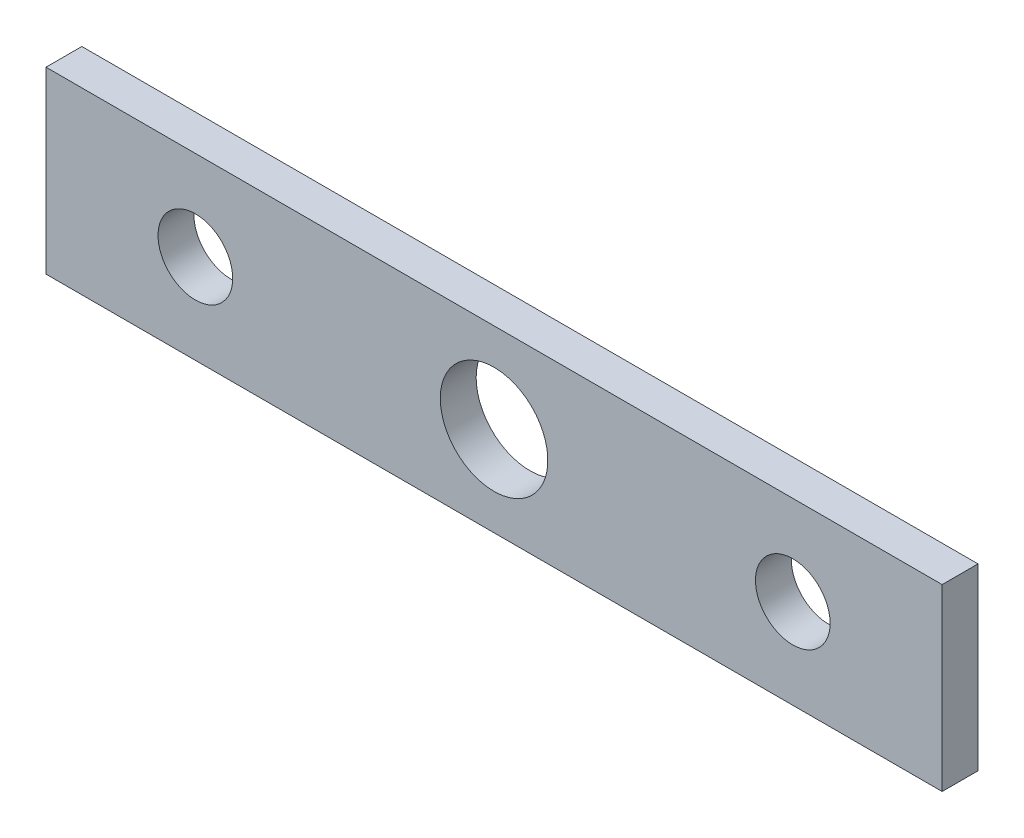
ISO-10303-21;
HEADER;
FILE_DESCRIPTION(('STEP AP214'),'2;1');
FILE_NAME('part.step','',(''),(''),'','','');
FILE_SCHEMA(('AUTOMOTIVE_DESIGN { 1 0 10303 214 1 1 1 1 }'));
ENDSEC;
DATA;
#1=APPLICATION_CONTEXT('core data for automotive mechanical design processes');
#2=APPLICATION_PROTOCOL_DEFINITION('international standard','automotive_design',2000,#1);
#3=PRODUCT_CONTEXT('',#1,'mechanical');
#4=PRODUCT('Part','Part','',(#3));
#5=PRODUCT_RELATED_PRODUCT_CATEGORY('part','',(#4));
#6=PRODUCT_DEFINITION_FORMATION('','',#4);
#7=PRODUCT_DEFINITION_CONTEXT('part definition',#1,'design');
#8=PRODUCT_DEFINITION('design','',#6,#7);
#9=PRODUCT_DEFINITION_SHAPE('','',#8);
#10=(LENGTH_UNIT() NAMED_UNIT(*) SI_UNIT(.MILLI.,.METRE.));
#11=(NAMED_UNIT(*) PLANE_ANGLE_UNIT() SI_UNIT($,.RADIAN.));
#12=(NAMED_UNIT(*) SI_UNIT($,.STERADIAN.) SOLID_ANGLE_UNIT());
#13=UNCERTAINTY_MEASURE_WITH_UNIT(LENGTH_MEASURE(1.E-05),#10,'distance_accuracy_value','');
#14=(GEOMETRIC_REPRESENTATION_CONTEXT(3) GLOBAL_UNCERTAINTY_ASSIGNED_CONTEXT((#13)) GLOBAL_UNIT_ASSIGNED_CONTEXT((#10,
#11,#12)) REPRESENTATION_CONTEXT('',''));
#15=CARTESIAN_POINT('',(0.,0.,0.));
#16=DIRECTION('',(0.,0.,1.));
#17=DIRECTION('',(1.,0.,0.));
#18=AXIS2_PLACEMENT_3D('',#15,#16,#17);
#19=CARTESIAN_POINT('',(0.,0.,12.));
#20=DIRECTION('',(0.,0.,-1.));
#21=DIRECTION('',(-1.,0.,0.));
#22=AXIS2_PLACEMENT_3D('',#19,#20,#21);
#23=PLANE('',#22);
#24=CARTESIAN_POINT('',(3.88578058618805E-13,0.,12.));
#25=DIRECTION('',(0.,0.,-1.));
#26=DIRECTION('',(-1.,0.,0.));
#27=AXIS2_PLACEMENT_3D('',#24,#25,#26);
#28=CIRCLE('',#27,18.);
#29=CARTESIAN_POINT('',(-17.9999999999996,0.,12.));
#30=VERTEX_POINT('',#29);
#31=EDGE_CURVE('E125',#30,#30,#28,.F.);
#32=ORIENTED_EDGE('',*,*,#31,.F.);
#33=EDGE_LOOP('',(#32));
#34=FACE_BOUND('',#33,.T.);
#35=DIRECTION('',(0.,1.,0.));
#36=VECTOR('',#35,1.);
#37=CARTESIAN_POINT('',(150.,-30.,12.));
#38=LINE('',#37,#36);
#39=CARTESIAN_POINT('',(150.,-30.,12.));
#40=VERTEX_POINT('',#39);
#41=CARTESIAN_POINT('',(150.,30.,12.));
#42=VERTEX_POINT('',#41);
#43=EDGE_CURVE('E89',#40,#42,#38,.T.);
#44=ORIENTED_EDGE('',*,*,#43,.T.);
#45=DIRECTION('',(-1.,0.,0.));
#46=VECTOR('',#45,1.);
#47=CARTESIAN_POINT('',(-150.,30.,12.));
#48=LINE('',#47,#46);
#49=CARTESIAN_POINT('',(-150.,30.,12.));
#50=VERTEX_POINT('',#49);
#51=EDGE_CURVE('E84',#42,#50,#48,.T.);
#52=ORIENTED_EDGE('',*,*,#51,.T.);
#53=DIRECTION('',(0.,-1.,0.));
#54=VECTOR('',#53,1.);
#55=CARTESIAN_POINT('',(-150.,-30.,12.));
#56=LINE('',#55,#54);
#57=CARTESIAN_POINT('',(-150.,-30.,12.));
#58=VERTEX_POINT('',#57);
#59=EDGE_CURVE('E87',#50,#58,#56,.T.);
#60=ORIENTED_EDGE('',*,*,#59,.T.);
#61=DIRECTION('',(1.,0.,0.));
#62=VECTOR('',#61,1.);
#63=CARTESIAN_POINT('',(-150.,-30.,12.));
#64=LINE('',#63,#62);
#65=EDGE_CURVE('E54',#58,#40,#64,.T.);
#66=ORIENTED_EDGE('',*,*,#65,.T.);
#67=EDGE_LOOP('',(#44,#52,#60,#66));
#68=FACE_BOUND('',#67,.T.);
#69=CARTESIAN_POINT('',(100.,0.,12.));
#70=DIRECTION('',(0.,0.,1.));
#71=DIRECTION('',(1.,0.,0.));
#72=AXIS2_PLACEMENT_3D('',#69,#70,#71);
#73=CIRCLE('',#72,12.5);
#74=CARTESIAN_POINT('',(112.5,0.,12.));
#75=VERTEX_POINT('',#74);
#76=EDGE_CURVE('E104',#75,#75,#73,.T.);
#77=ORIENTED_EDGE('',*,*,#76,.F.);
#78=EDGE_LOOP('',(#77));
#79=FACE_BOUND('',#78,.T.);
#80=CARTESIAN_POINT('',(-100.,0.,12.));
#81=DIRECTION('',(0.,0.,1.));
#82=DIRECTION('',(1.,0.,0.));
#83=AXIS2_PLACEMENT_3D('',#80,#81,#82);
#84=CIRCLE('',#83,12.5);
#85=CARTESIAN_POINT('',(-87.5,0.,12.));
#86=VERTEX_POINT('',#85);
#87=EDGE_CURVE('E119',#86,#86,#84,.T.);
#88=ORIENTED_EDGE('',*,*,#87,.F.);
#89=EDGE_LOOP('',(#88));
#90=FACE_BOUND('',#89,.T.);
#91=ADVANCED_FACE('F37',(#34,#68,#79,#90),#23,.F.);
#92=CARTESIAN_POINT('',(0.,0.,0.));
#93=DIRECTION('',(0.,0.,-1.));
#94=DIRECTION('',(-1.,0.,0.));
#95=AXIS2_PLACEMENT_3D('',#92,#93,#94);
#96=PLANE('',#95);
#97=CARTESIAN_POINT('',(3.88578058618805E-13,0.,0.));
#98=DIRECTION('',(0.,0.,-1.));
#99=DIRECTION('',(-1.,0.,0.));
#100=AXIS2_PLACEMENT_3D('',#97,#98,#99);
#101=CIRCLE('',#100,18.);
#102=CARTESIAN_POINT('',(-17.9999999999996,0.,0.));
#103=VERTEX_POINT('',#102);
#104=EDGE_CURVE('E130',#103,#103,#101,.T.);
#105=ORIENTED_EDGE('',*,*,#104,.F.);
#106=EDGE_LOOP('',(#105));
#107=FACE_BOUND('',#106,.T.);
#108=CARTESIAN_POINT('',(100.,0.,0.));
#109=DIRECTION('',(0.,0.,1.));
#110=DIRECTION('',(1.,0.,0.));
#111=AXIS2_PLACEMENT_3D('',#108,#109,#110);
#112=CIRCLE('',#111,12.5);
#113=CARTESIAN_POINT('',(112.5,0.,0.));
#114=VERTEX_POINT('',#113);
#115=EDGE_CURVE('E116',#114,#114,#112,.T.);
#116=ORIENTED_EDGE('',*,*,#115,.T.);
#117=EDGE_LOOP('',(#116));
#118=FACE_BOUND('',#117,.T.);
#119=DIRECTION('',(0.,1.,0.));
#120=VECTOR('',#119,1.);
#121=CARTESIAN_POINT('',(150.,-30.,0.));
#122=LINE('',#121,#120);
#123=CARTESIAN_POINT('',(150.,-30.,0.));
#124=VERTEX_POINT('',#123);
#125=CARTESIAN_POINT('',(150.,30.,0.));
#126=VERTEX_POINT('',#125);
#127=EDGE_CURVE('E101',#124,#126,#122,.T.);
#128=ORIENTED_EDGE('',*,*,#127,.F.);
#129=DIRECTION('',(1.,0.,0.));
#130=VECTOR('',#129,1.);
#131=CARTESIAN_POINT('',(-150.,-30.,0.));
#132=LINE('',#131,#130);
#133=CARTESIAN_POINT('',(-150.,-30.,0.));
#134=VERTEX_POINT('',#133);
#135=EDGE_CURVE('E77',#134,#124,#132,.T.);
#136=ORIENTED_EDGE('',*,*,#135,.F.);
#137=DIRECTION('',(0.,-1.,0.));
#138=VECTOR('',#137,1.);
#139=CARTESIAN_POINT('',(-150.,-30.,0.));
#140=LINE('',#139,#138);
#141=CARTESIAN_POINT('',(-150.,30.,0.));
#142=VERTEX_POINT('',#141);
#143=EDGE_CURVE('E71',#142,#134,#140,.T.);
#144=ORIENTED_EDGE('',*,*,#143,.F.);
#145=DIRECTION('',(-1.,0.,0.));
#146=VECTOR('',#145,1.);
#147=CARTESIAN_POINT('',(-150.,30.,0.));
#148=LINE('',#147,#146);
#149=EDGE_CURVE('E93',#126,#142,#148,.T.);
#150=ORIENTED_EDGE('',*,*,#149,.F.);
#151=EDGE_LOOP('',(#128,#136,#144,#150));
#152=FACE_BOUND('',#151,.T.);
#153=CARTESIAN_POINT('',(-100.,0.,0.));
#154=DIRECTION('',(0.,0.,1.));
#155=DIRECTION('',(1.,0.,0.));
#156=AXIS2_PLACEMENT_3D('',#153,#154,#155);
#157=CIRCLE('',#156,12.5);
#158=CARTESIAN_POINT('',(-87.5,0.,0.));
#159=VERTEX_POINT('',#158);
#160=EDGE_CURVE('E122',#159,#159,#157,.T.);
#161=ORIENTED_EDGE('',*,*,#160,.T.);
#162=EDGE_LOOP('',(#161));
#163=FACE_BOUND('',#162,.T.);
#164=ADVANCED_FACE('F112',(#107,#118,#152,#163),#96,.T.);
#165=CARTESIAN_POINT('',(150.,-30.,12.));
#166=DIRECTION('',(-1.,0.,0.));
#167=DIRECTION('',(0.,0.,1.));
#168=AXIS2_PLACEMENT_3D('',#165,#166,#167);
#169=PLANE('',#168);
#170=ORIENTED_EDGE('',*,*,#127,.T.);
#171=DIRECTION('',(0.,0.,-1.));
#172=VECTOR('',#171,1.);
#173=CARTESIAN_POINT('',(150.,30.,12.));
#174=LINE('',#173,#172);
#175=EDGE_CURVE('E11',#42,#126,#174,.T.);
#176=ORIENTED_EDGE('',*,*,#175,.F.);
#177=ORIENTED_EDGE('',*,*,#43,.F.);
#178=DIRECTION('',(0.,0.,-1.));
#179=VECTOR('',#178,1.);
#180=CARTESIAN_POINT('',(150.,-30.,12.));
#181=LINE('',#180,#179);
#182=EDGE_CURVE('E97',#40,#124,#181,.T.);
#183=ORIENTED_EDGE('',*,*,#182,.T.);
#184=EDGE_LOOP('',(#170,#176,#177,#183));
#185=FACE_BOUND('',#184,.T.);
#186=ADVANCED_FACE('F39',(#185),#169,.F.);
#187=CARTESIAN_POINT('',(-150.,30.,12.));
#188=DIRECTION('',(0.,-1.,0.));
#189=DIRECTION('',(0.,0.,-1.));
#190=AXIS2_PLACEMENT_3D('',#187,#188,#189);
#191=PLANE('',#190);
#192=ORIENTED_EDGE('',*,*,#149,.T.);
#193=DIRECTION('',(0.,0.,-1.));
#194=VECTOR('',#193,1.);
#195=CARTESIAN_POINT('',(-150.,30.,12.));
#196=LINE('',#195,#194);
#197=EDGE_CURVE('E46',#50,#142,#196,.T.);
#198=ORIENTED_EDGE('',*,*,#197,.F.);
#199=ORIENTED_EDGE('',*,*,#51,.F.);
#200=ORIENTED_EDGE('',*,*,#175,.T.);
#201=EDGE_LOOP('',(#192,#198,#199,#200));
#202=FACE_BOUND('',#201,.T.);
#203=ADVANCED_FACE('F92',(#202),#191,.F.);
#204=CARTESIAN_POINT('',(-150.,-30.,12.));
#205=DIRECTION('',(1.,0.,0.));
#206=DIRECTION('',(0.,0.,-1.));
#207=AXIS2_PLACEMENT_3D('',#204,#205,#206);
#208=PLANE('',#207);
#209=ORIENTED_EDGE('',*,*,#143,.T.);
#210=DIRECTION('',(0.,0.,-1.));
#211=VECTOR('',#210,1.);
#212=CARTESIAN_POINT('',(-150.,-30.,12.));
#213=LINE('',#212,#211);
#214=EDGE_CURVE('E94',#58,#134,#213,.T.);
#215=ORIENTED_EDGE('',*,*,#214,.F.);
#216=ORIENTED_EDGE('',*,*,#59,.F.);
#217=ORIENTED_EDGE('',*,*,#197,.T.);
#218=EDGE_LOOP('',(#209,#215,#216,#217));
#219=FACE_BOUND('',#218,.T.);
#220=ADVANCED_FACE('F95',(#219),#208,.F.);
#221=CARTESIAN_POINT('',(-150.,-30.,12.));
#222=DIRECTION('',(0.,1.,0.));
#223=DIRECTION('',(0.,0.,1.));
#224=AXIS2_PLACEMENT_3D('',#221,#222,#223);
#225=PLANE('',#224);
#226=ORIENTED_EDGE('',*,*,#135,.T.);
#227=ORIENTED_EDGE('',*,*,#182,.F.);
#228=ORIENTED_EDGE('',*,*,#65,.F.);
#229=ORIENTED_EDGE('',*,*,#214,.T.);
#230=EDGE_LOOP('',(#226,#227,#228,#229));
#231=FACE_BOUND('',#230,.T.);
#232=ADVANCED_FACE('F109',(#231),#225,.F.);
#233=CARTESIAN_POINT('',(100.,0.,12.));
#234=DIRECTION('',(0.,0.,-1.));
#235=DIRECTION('',(-1.,0.,0.));
#236=AXIS2_PLACEMENT_3D('',#233,#234,#235);
#237=CYLINDRICAL_SURFACE('',#236,12.5);
#238=ORIENTED_EDGE('',*,*,#76,.T.);
#239=EDGE_LOOP('',(#238));
#240=FACE_BOUND('',#239,.T.);
#241=ORIENTED_EDGE('',*,*,#115,.F.);
#242=EDGE_LOOP('',(#241));
#243=FACE_BOUND('',#242,.T.);
#244=ADVANCED_FACE('F142',(#240,#243),#237,.F.);
#245=CARTESIAN_POINT('',(-100.,0.,12.));
#246=DIRECTION('',(0.,0.,-1.));
#247=DIRECTION('',(-1.,0.,0.));
#248=AXIS2_PLACEMENT_3D('',#245,#246,#247);
#249=CYLINDRICAL_SURFACE('',#248,12.5);
#250=ORIENTED_EDGE('',*,*,#87,.T.);
#251=EDGE_LOOP('',(#250));
#252=FACE_BOUND('',#251,.T.);
#253=ORIENTED_EDGE('',*,*,#160,.F.);
#254=EDGE_LOOP('',(#253));
#255=FACE_BOUND('',#254,.T.);
#256=ADVANCED_FACE('F144',(#252,#255),#249,.F.);
#257=CARTESIAN_POINT('',(3.88578058618805E-13,0.,12.001));
#258=DIRECTION('',(0.,0.,-1.));
#259=DIRECTION('',(-1.,0.,0.));
#260=AXIS2_PLACEMENT_3D('',#257,#258,#259);
#261=CYLINDRICAL_SURFACE('',#260,18.);
#262=ORIENTED_EDGE('',*,*,#104,.T.);
#263=EDGE_LOOP('',(#262));
#264=FACE_BOUND('',#263,.T.);
#265=ORIENTED_EDGE('',*,*,#31,.T.);
#266=EDGE_LOOP('',(#265));
#267=FACE_BOUND('',#266,.T.);
#268=ADVANCED_FACE('F134',(#264,#267),#261,.F.);
#269=CLOSED_SHELL('',(#91,#164,#186,#203,#220,#232,#244,#256,#268));
#270=MANIFOLD_SOLID_BREP('B2',#269);
#271=ADVANCED_BREP_SHAPE_REPRESENTATION('',(#18,#270),#14);
#272=SHAPE_DEFINITION_REPRESENTATION(#9,#271);
ENDSEC;
END-ISO-10303-21;
